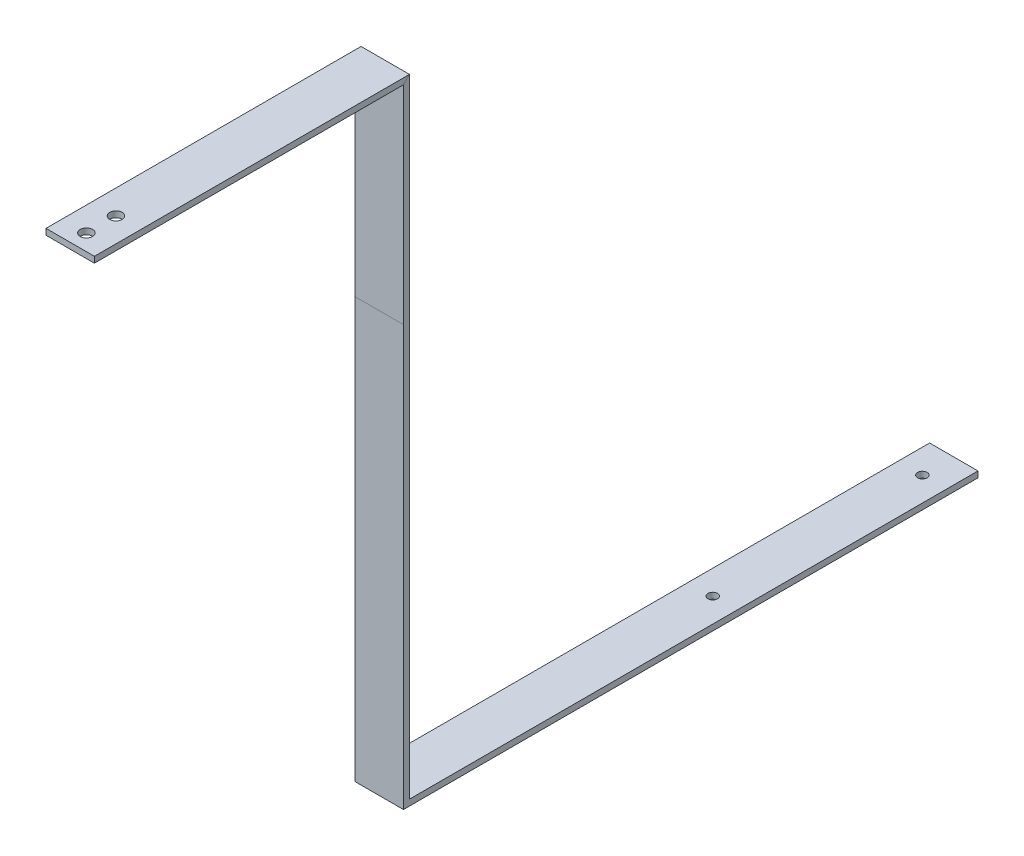
ISO-10303-21;
HEADER;
FILE_DESCRIPTION(('STEP AP214'),'2;1');
FILE_NAME('part.step','',(''),(''),'','','');
FILE_SCHEMA(('AUTOMOTIVE_DESIGN { 1 0 10303 214 1 1 1 1 }'));
ENDSEC;
DATA;
#1=APPLICATION_CONTEXT('core data for automotive mechanical design processes');
#2=APPLICATION_PROTOCOL_DEFINITION('international standard','automotive_design',2000,#1);
#3=PRODUCT_CONTEXT('',#1,'mechanical');
#4=PRODUCT('Part','Part','',(#3));
#5=PRODUCT_RELATED_PRODUCT_CATEGORY('part','',(#4));
#6=PRODUCT_DEFINITION_FORMATION('','',#4);
#7=PRODUCT_DEFINITION_CONTEXT('part definition',#1,'design');
#8=PRODUCT_DEFINITION('design','',#6,#7);
#9=PRODUCT_DEFINITION_SHAPE('','',#8);
#10=(LENGTH_UNIT() NAMED_UNIT(*) SI_UNIT(.MILLI.,.METRE.));
#11=(NAMED_UNIT(*) PLANE_ANGLE_UNIT() SI_UNIT($,.RADIAN.));
#12=(NAMED_UNIT(*) SI_UNIT($,.STERADIAN.) SOLID_ANGLE_UNIT());
#13=UNCERTAINTY_MEASURE_WITH_UNIT(LENGTH_MEASURE(1.E-05),#10,'distance_accuracy_value','');
#14=(GEOMETRIC_REPRESENTATION_CONTEXT(3) GLOBAL_UNCERTAINTY_ASSIGNED_CONTEXT((#13)) GLOBAL_UNIT_ASSIGNED_CONTEXT((#10,
#11,#12)) REPRESENTATION_CONTEXT('',''));
#15=CARTESIAN_POINT('',(0.,0.,0.));
#16=DIRECTION('',(0.,0.,1.));
#17=DIRECTION('',(1.,0.,0.));
#18=AXIS2_PLACEMENT_3D('',#15,#16,#17);
#19=CARTESIAN_POINT('',(-96.5999999999999,-272.07792076474,612.092449283312));
#20=DIRECTION('',(0.,-1.,0.));
#21=DIRECTION('',(0.,0.,-1.));
#22=AXIS2_PLACEMENT_3D('',#19,#20,#21);
#23=PLANE('',#22);
#24=DIRECTION('',(-1.,0.,0.));
#25=VECTOR('',#24,1.);
#26=CARTESIAN_POINT('',(-96.5999999999999,-272.07792076474,0.00397627219106411));
#27=LINE('',#26,#25);
#28=CARTESIAN_POINT('',(25.4,-272.07792076474,0.0039762721910086));
#29=VERTEX_POINT('',#28);
#30=CARTESIAN_POINT('',(-25.4,-272.07792076474,0.00397627219106411));
#31=VERTEX_POINT('',#30);
#32=EDGE_CURVE('E11',#29,#31,#27,.T.);
#33=ORIENTED_EDGE('',*,*,#32,.F.);
#34=DIRECTION('',(0.,0.,-1.));
#35=VECTOR('',#34,1.);
#36=CARTESIAN_POINT('',(25.4,-272.07792076474,612.092449283312));
#37=LINE('',#36,#35);
#38=CARTESIAN_POINT('',(25.4,-272.07792076474,0.));
#39=VERTEX_POINT('',#38);
#40=EDGE_CURVE('E166',#29,#39,#37,.T.);
#41=ORIENTED_EDGE('',*,*,#40,.T.);
#42=DIRECTION('',(1.,0.,0.));
#43=VECTOR('',#42,1.);
#44=CARTESIAN_POINT('',(0.,-272.07792076474,0.));
#45=LINE('',#44,#43);
#46=CARTESIAN_POINT('',(-25.4,-272.07792076474,0.));
#47=VERTEX_POINT('',#46);
#48=EDGE_CURVE('E283',#47,#39,#45,.T.);
#49=ORIENTED_EDGE('',*,*,#48,.F.);
#50=DIRECTION('',(0.,0.,-1.));
#51=VECTOR('',#50,1.);
#52=CARTESIAN_POINT('',(-25.4,-272.07792076474,574.));
#53=LINE('',#52,#51);
#54=EDGE_CURVE('E279',#31,#47,#53,.T.);
#55=ORIENTED_EDGE('',*,*,#54,.F.);
#56=EDGE_LOOP('',(#33,#41,#49,#55));
#57=FACE_BOUND('',#56,.T.);
#58=ADVANCED_FACE('F37',(#57),#23,.F.);
#59=CARTESIAN_POINT('',(25.4,3.155,574.));
#60=DIRECTION('',(-1.,0.,0.));
#61=DIRECTION('',(0.,0.,1.));
#62=AXIS2_PLACEMENT_3D('',#59,#60,#61);
#63=PLANE('',#62);
#64=DIRECTION('',(0.,1.,0.));
#65=VECTOR('',#64,1.);
#66=CARTESIAN_POINT('',(25.4,-278.803420764741,6.3139762721911));
#67=LINE('',#66,#65);
#68=CARTESIAN_POINT('',(25.4,-272.078734833776,6.31088055029496));
#69=VERTEX_POINT('',#68);
#70=CARTESIAN_POINT('',(25.4,-54.0479207647403,6.31397627219113));
#71=VERTEX_POINT('',#70);
#72=EDGE_CURVE('E180',#69,#71,#67,.T.);
#73=ORIENTED_EDGE('',*,*,#72,.F.);
#74=DIRECTION('',(0.,1.,0.));
#75=VECTOR('',#74,1.);
#76=CARTESIAN_POINT('',(25.4,-712.845,6.31000000000004));
#77=LINE('',#76,#75);
#78=CARTESIAN_POINT('',(25.4,-712.845,6.31000000000004));
#79=VERTEX_POINT('',#78);
#80=EDGE_CURVE('E41',#79,#69,#77,.T.);
#81=ORIENTED_EDGE('',*,*,#80,.F.);
#82=DIRECTION('',(0.,0.,-1.));
#83=VECTOR('',#82,1.);
#84=CARTESIAN_POINT('',(25.4,-712.845,0.));
#85=LINE('',#84,#83);
#86=CARTESIAN_POINT('',(25.4,-712.845,-596.7));
#87=VERTEX_POINT('',#86);
#88=EDGE_CURVE('E132',#79,#87,#85,.T.);
#89=ORIENTED_EDGE('',*,*,#88,.T.);
#90=DIRECTION('',(0.,1.,0.));
#91=VECTOR('',#90,1.);
#92=CARTESIAN_POINT('',(25.4,-706.535,-596.7));
#93=LINE('',#92,#91);
#94=CARTESIAN_POINT('',(25.4,-706.535,-596.7));
#95=VERTEX_POINT('',#94);
#96=EDGE_CURVE('E142',#87,#95,#93,.T.);
#97=ORIENTED_EDGE('',*,*,#96,.T.);
#98=DIRECTION('',(0.,0.,1.));
#99=VECTOR('',#98,1.);
#100=CARTESIAN_POINT('',(25.4,-706.535,-596.7));
#101=LINE('',#100,#99);
#102=CARTESIAN_POINT('',(25.4,-706.535,0.));
#103=VERTEX_POINT('',#102);
#104=EDGE_CURVE('E157',#95,#103,#101,.T.);
#105=ORIENTED_EDGE('',*,*,#104,.T.);
#106=DIRECTION('',(0.,1.,0.));
#107=VECTOR('',#106,1.);
#108=CARTESIAN_POINT('',(25.4,3.155,0.));
#109=LINE('',#108,#107);
#110=EDGE_CURVE('E55',#103,#39,#109,.T.);
#111=ORIENTED_EDGE('',*,*,#110,.T.);
#112=ORIENTED_EDGE('',*,*,#40,.F.);
#113=DIRECTION('',(0.,1.,0.));
#114=VECTOR('',#113,1.);
#115=CARTESIAN_POINT('',(25.4,-278.803420764741,0.0039762721910086));
#116=LINE('',#115,#114);
#117=CARTESIAN_POINT('',(25.4,-47.7379207647403,0.00397627219104076));
#118=VERTEX_POINT('',#117);
#119=EDGE_CURVE('E178',#29,#118,#116,.T.);
#120=ORIENTED_EDGE('',*,*,#119,.T.);
#121=DIRECTION('',(0.,0.707106781186548,-0.707106781186548));
#122=VECTOR('',#121,1.);
#123=CARTESIAN_POINT('',(25.4,-163.27067076474,115.536726272191));
#124=LINE('',#123,#122);
#125=EDGE_CURVE('E173',#71,#118,#124,.T.);
#126=ORIENTED_EDGE('',*,*,#125,.F.);
#127=EDGE_LOOP('',(#73,#81,#89,#97,#105,#111,#112,#120,#126));
#128=FACE_BOUND('',#127,.T.);
#129=ADVANCED_FACE('F39',(#128),#63,.F.);
#130=CARTESIAN_POINT('',(-25.4,3.155,574.));
#131=DIRECTION('',(1.,0.,0.));
#132=DIRECTION('',(0.,0.,-1.));
#133=AXIS2_PLACEMENT_3D('',#130,#131,#132);
#134=PLANE('',#133);
#135=DIRECTION('',(0.,-1.,0.));
#136=VECTOR('',#135,1.);
#137=CARTESIAN_POINT('',(-25.4,3.155,0.));
#138=LINE('',#137,#136);
#139=CARTESIAN_POINT('',(-25.4,-706.535,0.));
#140=VERTEX_POINT('',#139);
#141=EDGE_CURVE('E277',#47,#140,#138,.T.);
#142=ORIENTED_EDGE('',*,*,#141,.T.);
#143=DIRECTION('',(0.,0.,1.));
#144=VECTOR('',#143,1.);
#145=CARTESIAN_POINT('',(-25.4,-706.535,-596.7));
#146=LINE('',#145,#144);
#147=CARTESIAN_POINT('',(-25.4,-706.535,-596.7));
#148=VERTEX_POINT('',#147);
#149=EDGE_CURVE('E146',#148,#140,#146,.T.);
#150=ORIENTED_EDGE('',*,*,#149,.F.);
#151=DIRECTION('',(0.,-1.,0.));
#152=VECTOR('',#151,1.);
#153=CARTESIAN_POINT('',(-25.4,-706.535,-596.7));
#154=LINE('',#153,#152);
#155=CARTESIAN_POINT('',(-25.4,-712.845,-596.7));
#156=VERTEX_POINT('',#155);
#157=EDGE_CURVE('E139',#148,#156,#154,.T.);
#158=ORIENTED_EDGE('',*,*,#157,.T.);
#159=DIRECTION('',(0.,0.,1.));
#160=VECTOR('',#159,1.);
#161=CARTESIAN_POINT('',(-25.4,-712.845,0.));
#162=LINE('',#161,#160);
#163=CARTESIAN_POINT('',(-25.4,-712.845,6.31000000000004));
#164=VERTEX_POINT('',#163);
#165=EDGE_CURVE('E123',#156,#164,#162,.T.);
#166=ORIENTED_EDGE('',*,*,#165,.T.);
#167=DIRECTION('',(0.,1.,0.));
#168=VECTOR('',#167,1.);
#169=CARTESIAN_POINT('',(-25.4,-712.845,6.31000000000004));
#170=LINE('',#169,#168);
#171=CARTESIAN_POINT('',(-25.4,-272.078734833776,6.31088055029493));
#172=VERTEX_POINT('',#171);
#173=EDGE_CURVE('E265',#164,#172,#170,.T.);
#174=ORIENTED_EDGE('',*,*,#173,.T.);
#175=DIRECTION('',(0.,1.,0.));
#176=VECTOR('',#175,1.);
#177=CARTESIAN_POINT('',(-25.4,-278.803420764741,6.31397627219099));
#178=LINE('',#177,#176);
#179=CARTESIAN_POINT('',(-25.4,-54.0479207647402,6.31397627219104));
#180=VERTEX_POINT('',#179);
#181=EDGE_CURVE('E176',#172,#180,#178,.T.);
#182=ORIENTED_EDGE('',*,*,#181,.T.);
#183=DIRECTION('',(0.,-0.707106781186548,0.707106781186548));
#184=VECTOR('',#183,1.);
#185=CARTESIAN_POINT('',(-25.4,-163.27067076474,115.536726272191));
#186=LINE('',#185,#184);
#187=CARTESIAN_POINT('',(-25.4,-47.7379207647403,0.00397627219104109));
#188=VERTEX_POINT('',#187);
#189=EDGE_CURVE('E167',#188,#180,#186,.T.);
#190=ORIENTED_EDGE('',*,*,#189,.F.);
#191=DIRECTION('',(0.,1.,0.));
#192=VECTOR('',#191,1.);
#193=CARTESIAN_POINT('',(-25.4,-278.803420764741,0.0039762721910086));
#194=LINE('',#193,#192);
#195=EDGE_CURVE('E174',#31,#188,#194,.T.);
#196=ORIENTED_EDGE('',*,*,#195,.F.);
#197=ORIENTED_EDGE('',*,*,#54,.T.);
#198=EDGE_LOOP('',(#142,#150,#158,#166,#174,#182,#190,#196,#197));
#199=FACE_BOUND('',#198,.T.);
#200=ADVANCED_FACE('F144',(#199),#134,.F.);
#201=CARTESIAN_POINT('',(0.,0.,0.));
#202=DIRECTION('',(0.,0.,1.));
#203=DIRECTION('',(1.,0.,0.));
#204=AXIS2_PLACEMENT_3D('',#201,#202,#203);
#205=PLANE('',#204);
#206=ORIENTED_EDGE('',*,*,#110,.F.);
#207=DIRECTION('',(-1.,0.,0.));
#208=VECTOR('',#207,1.);
#209=CARTESIAN_POINT('',(0.,-706.535,0.));
#210=LINE('',#209,#208);
#211=EDGE_CURVE('E59',#103,#140,#210,.T.);
#212=ORIENTED_EDGE('',*,*,#211,.T.);
#213=ORIENTED_EDGE('',*,*,#141,.F.);
#214=ORIENTED_EDGE('',*,*,#48,.T.);
#215=EDGE_LOOP('',(#206,#212,#213,#214));
#216=FACE_BOUND('',#215,.T.);
#217=ADVANCED_FACE('F259',(#216),#205,.F.);
#218=CARTESIAN_POINT('',(-25.4,-712.845,6.31000000000004));
#219=DIRECTION('',(0.,0.,1.));
#220=DIRECTION('',(1.,0.,0.));
#221=AXIS2_PLACEMENT_3D('',#218,#219,#220);
#222=PLANE('',#221);
#223=CARTESIAN_POINT('',(-25.4,-272.07792076474,6.31397627219099));
#224=DIRECTION('',(1.,0.,0.));
#225=VECTOR('',#224,1.);
#226=LINE('',#223,#225);
#227=EDGE_CURVE('E47',#172,#69,#226,.T.);
#228=ORIENTED_EDGE('',*,*,#227,.F.);
#229=ORIENTED_EDGE('',*,*,#173,.F.);
#230=DIRECTION('',(1.,0.,0.));
#231=VECTOR('',#230,1.);
#232=CARTESIAN_POINT('',(-25.4,-712.845,6.31000000000004));
#233=LINE('',#232,#231);
#234=EDGE_CURVE('E129',#164,#79,#233,.T.);
#235=ORIENTED_EDGE('',*,*,#234,.T.);
#236=ORIENTED_EDGE('',*,*,#80,.T.);
#237=EDGE_LOOP('',(#228,#229,#235,#236));
#238=FACE_BOUND('',#237,.T.);
#239=ADVANCED_FACE('F254',(#238),#222,.T.);
#240=CARTESIAN_POINT('',(0.,-712.845,0.));
#241=DIRECTION('',(0.,1.,0.));
#242=DIRECTION('',(0.,0.,1.));
#243=AXIS2_PLACEMENT_3D('',#240,#241,#242);
#244=PLANE('',#243);
#245=CARTESIAN_POINT('',(0.,-712.845,-343.7));
#246=DIRECTION('',(0.,1.,0.));
#247=DIRECTION('',(0.,0.,1.));
#248=AXIS2_PLACEMENT_3D('',#245,#246,#247);
#249=CIRCLE('',#248,5.);
#250=CARTESIAN_POINT('',(0.,-712.845,-338.7));
#251=VERTEX_POINT('',#250);
#252=EDGE_CURVE('E441',#251,#251,#249,.T.);
#253=ORIENTED_EDGE('',*,*,#252,.T.);
#254=EDGE_LOOP('',(#253));
#255=FACE_BOUND('',#254,.T.);
#256=CARTESIAN_POINT('',(0.,-712.845,-563.7));
#257=DIRECTION('',(0.,1.,0.));
#258=DIRECTION('',(0.,0.,1.));
#259=AXIS2_PLACEMENT_3D('',#256,#257,#258);
#260=CIRCLE('',#259,5.);
#261=CARTESIAN_POINT('',(0.,-712.845,-558.7));
#262=VERTEX_POINT('',#261);
#263=EDGE_CURVE('E147',#262,#262,#260,.T.);
#264=ORIENTED_EDGE('',*,*,#263,.T.);
#265=EDGE_LOOP('',(#264));
#266=FACE_BOUND('',#265,.T.);
#267=ORIENTED_EDGE('',*,*,#88,.F.);
#268=ORIENTED_EDGE('',*,*,#234,.F.);
#269=ORIENTED_EDGE('',*,*,#165,.F.);
#270=DIRECTION('',(1.,0.,0.));
#271=VECTOR('',#270,1.);
#272=CARTESIAN_POINT('',(25.4,-712.845,-596.7));
#273=LINE('',#272,#271);
#274=EDGE_CURVE('E127',#156,#87,#273,.T.);
#275=ORIENTED_EDGE('',*,*,#274,.T.);
#276=EDGE_LOOP('',(#267,#268,#269,#275));
#277=FACE_BOUND('',#276,.T.);
#278=ADVANCED_FACE('F126',(#255,#266,#277),#244,.F.);
#279=CARTESIAN_POINT('',(-25.4,-278.803420764741,0.0039762721910086));
#280=DIRECTION('',(0.,0.,1.));
#281=DIRECTION('',(1.,0.,0.));
#282=AXIS2_PLACEMENT_3D('',#279,#280,#281);
#283=PLANE('',#282);
#284=ORIENTED_EDGE('',*,*,#119,.F.);
#285=ORIENTED_EDGE('',*,*,#32,.T.);
#286=ORIENTED_EDGE('',*,*,#195,.T.);
#287=DIRECTION('',(-1.,0.,0.));
#288=VECTOR('',#287,1.);
#289=CARTESIAN_POINT('',(-25.4,-47.7379207647402,0.0039762721910086));
#290=LINE('',#289,#288);
#291=EDGE_CURVE('E170',#118,#188,#290,.T.);
#292=ORIENTED_EDGE('',*,*,#291,.F.);
#293=EDGE_LOOP('',(#284,#285,#286,#292));
#294=FACE_BOUND('',#293,.T.);
#295=ADVANCED_FACE('F225',(#294),#283,.F.);
#296=CARTESIAN_POINT('',(0.,-326.125841529481,330.698976272191));
#297=DIRECTION('',(0.,0.,1.));
#298=DIRECTION('',(-1.,0.,0.));
#299=AXIS2_PLACEMENT_3D('',#296,#297,#298);
#300=PLANE('',#299);
#301=DIRECTION('',(0.,-1.,0.));
#302=VECTOR('',#301,1.);
#303=CARTESIAN_POINT('',(25.4,-47.7379207647403,330.698976272191));
#304=LINE('',#303,#302);
#305=CARTESIAN_POINT('',(25.4,-47.7379207647403,330.698976272191));
#306=VERTEX_POINT('',#305);
#307=CARTESIAN_POINT('',(25.4,-54.0479207647404,330.698976272191));
#308=VERTEX_POINT('',#307);
#309=EDGE_CURVE('E188',#306,#308,#304,.T.);
#310=ORIENTED_EDGE('',*,*,#309,.F.);
#311=DIRECTION('',(1.,0.,0.));
#312=VECTOR('',#311,1.);
#313=CARTESIAN_POINT('',(-25.4,-47.7379207647403,330.698976272191));
#314=LINE('',#313,#312);
#315=CARTESIAN_POINT('',(-25.4,-47.7379207647403,330.698976272191));
#316=VERTEX_POINT('',#315);
#317=EDGE_CURVE('E162',#316,#306,#314,.T.);
#318=ORIENTED_EDGE('',*,*,#317,.F.);
#319=DIRECTION('',(0.,1.,0.));
#320=VECTOR('',#319,1.);
#321=CARTESIAN_POINT('',(-25.4,-47.7379207647403,330.698976272191));
#322=LINE('',#321,#320);
#323=CARTESIAN_POINT('',(-25.4,-54.0479207647402,330.698976272191));
#324=VERTEX_POINT('',#323);
#325=EDGE_CURVE('E184',#324,#316,#322,.T.);
#326=ORIENTED_EDGE('',*,*,#325,.F.);
#327=DIRECTION('',(-1.,0.,0.));
#328=VECTOR('',#327,1.);
#329=CARTESIAN_POINT('',(-25.4,-54.0479207647402,330.698976272191));
#330=LINE('',#329,#328);
#331=EDGE_CURVE('E186',#308,#324,#330,.T.);
#332=ORIENTED_EDGE('',*,*,#331,.F.);
#333=EDGE_LOOP('',(#310,#318,#326,#332));
#334=FACE_BOUND('',#333,.T.);
#335=ADVANCED_FACE('F229',(#334),#300,.T.);
#336=CARTESIAN_POINT('',(25.4,-47.7379207647403,-0.411523727808952));
#337=DIRECTION('',(-1.,0.,0.));
#338=DIRECTION('',(0.,-1.,0.));
#339=AXIS2_PLACEMENT_3D('',#336,#337,#338);
#340=PLANE('',#339);
#341=ORIENTED_EDGE('',*,*,#125,.T.);
#342=DIRECTION('',(0.,0.,1.));
#343=VECTOR('',#342,1.);
#344=CARTESIAN_POINT('',(25.4,-47.7379207647403,-0.411523727808952));
#345=LINE('',#344,#343);
#346=EDGE_CURVE('E177',#118,#306,#345,.T.);
#347=ORIENTED_EDGE('',*,*,#346,.T.);
#348=ORIENTED_EDGE('',*,*,#309,.T.);
#349=DIRECTION('',(0.,0.,1.));
#350=VECTOR('',#349,1.);
#351=CARTESIAN_POINT('',(25.4,-54.0479207647404,-0.411523727808951));
#352=LINE('',#351,#350);
#353=EDGE_CURVE('E196',#71,#308,#352,.T.);
#354=ORIENTED_EDGE('',*,*,#353,.F.);
#355=EDGE_LOOP('',(#341,#347,#348,#354));
#356=FACE_BOUND('',#355,.T.);
#357=ADVANCED_FACE('F231',(#356),#340,.F.);
#358=CARTESIAN_POINT('',(-25.4,-54.0479207647402,-0.411523727808951));
#359=DIRECTION('',(0.,1.,0.));
#360=DIRECTION('',(-1.,0.,0.));
#361=AXIS2_PLACEMENT_3D('',#358,#359,#360);
#362=PLANE('',#361);
#363=CARTESIAN_POINT('',(0.,-54.0479207647403,282.69897627246));
#364=DIRECTION('',(0.,1.,0.));
#365=DIRECTION('',(-1.,0.,0.));
#366=AXIS2_PLACEMENT_3D('',#363,#364,#365);
#367=CIRCLE('',#366,6.5);
#368=CARTESIAN_POINT('',(-6.5,-54.0479207647403,282.69897627246));
#369=VERTEX_POINT('',#368);
#370=EDGE_CURVE('E428',#369,#369,#367,.T.);
#371=ORIENTED_EDGE('',*,*,#370,.T.);
#372=EDGE_LOOP('',(#371));
#373=FACE_BOUND('',#372,.T.);
#374=CARTESIAN_POINT('',(0.,-54.0479207647403,313.69897627246));
#375=DIRECTION('',(0.,1.,0.));
#376=DIRECTION('',(-1.,0.,0.));
#377=AXIS2_PLACEMENT_3D('',#374,#375,#376);
#378=CIRCLE('',#377,6.5);
#379=CARTESIAN_POINT('',(-6.5,-54.0479207647403,313.69897627246));
#380=VERTEX_POINT('',#379);
#381=EDGE_CURVE('E432',#380,#380,#378,.T.);
#382=ORIENTED_EDGE('',*,*,#381,.T.);
#383=EDGE_LOOP('',(#382));
#384=FACE_BOUND('',#383,.T.);
#385=DIRECTION('',(1.,0.,0.));
#386=VECTOR('',#385,1.);
#387=CARTESIAN_POINT('',(-25.3999999999995,-54.0479207647402,6.31397627219099));
#388=LINE('',#387,#386);
#389=EDGE_CURVE('E163',#180,#71,#388,.T.);
#390=ORIENTED_EDGE('',*,*,#389,.T.);
#391=ORIENTED_EDGE('',*,*,#353,.T.);
#392=ORIENTED_EDGE('',*,*,#331,.T.);
#393=DIRECTION('',(0.,0.,1.));
#394=VECTOR('',#393,1.);
#395=CARTESIAN_POINT('',(-25.4,-54.0479207647402,-0.411523727808951));
#396=LINE('',#395,#394);
#397=EDGE_CURVE('E193',#180,#324,#396,.T.);
#398=ORIENTED_EDGE('',*,*,#397,.F.);
#399=EDGE_LOOP('',(#390,#391,#392,#398));
#400=FACE_BOUND('',#399,.T.);
#401=ADVANCED_FACE('F234',(#373,#384,#400),#362,.F.);
#402=CARTESIAN_POINT('',(-25.4,-47.7379207647403,-0.411523727808952));
#403=DIRECTION('',(1.,0.,0.));
#404=DIRECTION('',(0.,1.,0.));
#405=AXIS2_PLACEMENT_3D('',#402,#403,#404);
#406=PLANE('',#405);
#407=ORIENTED_EDGE('',*,*,#189,.T.);
#408=ORIENTED_EDGE('',*,*,#397,.T.);
#409=ORIENTED_EDGE('',*,*,#325,.T.);
#410=DIRECTION('',(0.,0.,1.));
#411=VECTOR('',#410,1.);
#412=CARTESIAN_POINT('',(-25.4,-47.7379207647403,-0.411523727808952));
#413=LINE('',#412,#411);
#414=EDGE_CURVE('E190',#188,#316,#413,.T.);
#415=ORIENTED_EDGE('',*,*,#414,.F.);
#416=EDGE_LOOP('',(#407,#408,#409,#415));
#417=FACE_BOUND('',#416,.T.);
#418=ADVANCED_FACE('F238',(#417),#406,.F.);
#419=CARTESIAN_POINT('',(-25.4,-47.7379207647403,-0.411523727808952));
#420=DIRECTION('',(0.,-1.,0.));
#421=DIRECTION('',(1.,0.,0.));
#422=AXIS2_PLACEMENT_3D('',#419,#420,#421);
#423=PLANE('',#422);
#424=CARTESIAN_POINT('',(0.,-47.7379207647403,282.69897627246));
#425=DIRECTION('',(0.,1.,0.));
#426=DIRECTION('',(-1.,0.,0.));
#427=AXIS2_PLACEMENT_3D('',#424,#425,#426);
#428=CIRCLE('',#427,6.5);
#429=CARTESIAN_POINT('',(-6.5,-47.7379207647403,282.69897627246));
#430=VERTEX_POINT('',#429);
#431=EDGE_CURVE('E425',#430,#430,#428,.T.);
#432=ORIENTED_EDGE('',*,*,#431,.F.);
#433=EDGE_LOOP('',(#432));
#434=FACE_BOUND('',#433,.T.);
#435=CARTESIAN_POINT('',(0.,-47.7379207647403,313.69897627246));
#436=DIRECTION('',(0.,1.,0.));
#437=DIRECTION('',(-1.,0.,0.));
#438=AXIS2_PLACEMENT_3D('',#435,#436,#437);
#439=CIRCLE('',#438,6.5);
#440=CARTESIAN_POINT('',(-6.5,-47.7379207647403,313.69897627246));
#441=VERTEX_POINT('',#440);
#442=EDGE_CURVE('E429',#441,#441,#439,.T.);
#443=ORIENTED_EDGE('',*,*,#442,.F.);
#444=EDGE_LOOP('',(#443));
#445=FACE_BOUND('',#444,.T.);
#446=ORIENTED_EDGE('',*,*,#291,.T.);
#447=ORIENTED_EDGE('',*,*,#414,.T.);
#448=ORIENTED_EDGE('',*,*,#317,.T.);
#449=ORIENTED_EDGE('',*,*,#346,.F.);
#450=EDGE_LOOP('',(#446,#447,#448,#449));
#451=FACE_BOUND('',#450,.T.);
#452=ADVANCED_FACE('F224',(#434,#445,#451),#423,.F.);
#453=CARTESIAN_POINT('',(-25.4,-278.803420764741,6.31397627219099));
#454=DIRECTION('',(0.,0.,-1.));
#455=DIRECTION('',(-1.,0.,0.));
#456=AXIS2_PLACEMENT_3D('',#453,#454,#455);
#457=PLANE('',#456);
#458=ORIENTED_EDGE('',*,*,#181,.F.);
#459=ORIENTED_EDGE('',*,*,#227,.T.);
#460=ORIENTED_EDGE('',*,*,#72,.T.);
#461=ORIENTED_EDGE('',*,*,#389,.F.);
#462=EDGE_LOOP('',(#458,#459,#460,#461));
#463=FACE_BOUND('',#462,.T.);
#464=ADVANCED_FACE('F213',(#463),#457,.F.);
#465=CARTESIAN_POINT('',(25.4,-706.535,-596.7));
#466=DIRECTION('',(0.,1.,0.));
#467=DIRECTION('',(0.,0.,1.));
#468=AXIS2_PLACEMENT_3D('',#465,#466,#467);
#469=PLANE('',#468);
#470=CARTESIAN_POINT('',(0.,-706.535,-343.7));
#471=DIRECTION('',(0.,1.,0.));
#472=DIRECTION('',(0.,0.,1.));
#473=AXIS2_PLACEMENT_3D('',#470,#471,#472);
#474=CIRCLE('',#473,5.);
#475=CARTESIAN_POINT('',(0.,-706.535,-338.7));
#476=VERTEX_POINT('',#475);
#477=EDGE_CURVE('E438',#476,#476,#474,.T.);
#478=ORIENTED_EDGE('',*,*,#477,.F.);
#479=EDGE_LOOP('',(#478));
#480=FACE_BOUND('',#479,.T.);
#481=CARTESIAN_POINT('',(0.,-706.535,-563.7));
#482=DIRECTION('',(0.,1.,0.));
#483=DIRECTION('',(0.,0.,1.));
#484=AXIS2_PLACEMENT_3D('',#481,#482,#483);
#485=CIRCLE('',#484,5.);
#486=CARTESIAN_POINT('',(0.,-706.535,-558.7));
#487=VERTEX_POINT('',#486);
#488=EDGE_CURVE('E150',#487,#487,#485,.T.);
#489=ORIENTED_EDGE('',*,*,#488,.F.);
#490=EDGE_LOOP('',(#489));
#491=FACE_BOUND('',#490,.T.);
#492=ORIENTED_EDGE('',*,*,#211,.F.);
#493=ORIENTED_EDGE('',*,*,#104,.F.);
#494=DIRECTION('',(-1.,0.,0.));
#495=VECTOR('',#494,1.);
#496=CARTESIAN_POINT('',(25.4,-706.535,-596.7));
#497=LINE('',#496,#495);
#498=EDGE_CURVE('E155',#95,#148,#497,.T.);
#499=ORIENTED_EDGE('',*,*,#498,.T.);
#500=ORIENTED_EDGE('',*,*,#149,.T.);
#501=EDGE_LOOP('',(#492,#493,#499,#500));
#502=FACE_BOUND('',#501,.T.);
#503=ADVANCED_FACE('F223',(#480,#491,#502),#469,.T.);
#504=CARTESIAN_POINT('',(0.,0.,-596.7));
#505=DIRECTION('',(0.,0.,-1.));
#506=DIRECTION('',(-1.,0.,0.));
#507=AXIS2_PLACEMENT_3D('',#504,#505,#506);
#508=PLANE('',#507);
#509=ORIENTED_EDGE('',*,*,#157,.F.);
#510=ORIENTED_EDGE('',*,*,#498,.F.);
#511=ORIENTED_EDGE('',*,*,#96,.F.);
#512=ORIENTED_EDGE('',*,*,#274,.F.);
#513=EDGE_LOOP('',(#509,#510,#511,#512));
#514=FACE_BOUND('',#513,.T.);
#515=ADVANCED_FACE('F137',(#514),#508,.T.);
#516=CARTESIAN_POINT('',(0.,-716.535,-563.7));
#517=DIRECTION('',(0.,1.,0.));
#518=DIRECTION('',(0.,0.,1.));
#519=AXIS2_PLACEMENT_3D('',#516,#517,#518);
#520=CYLINDRICAL_SURFACE('',#519,5.);
#521=ORIENTED_EDGE('',*,*,#488,.T.);
#522=EDGE_LOOP('',(#521));
#523=FACE_BOUND('',#522,.T.);
#524=ORIENTED_EDGE('',*,*,#263,.F.);
#525=EDGE_LOOP('',(#524));
#526=FACE_BOUND('',#525,.T.);
#527=ADVANCED_FACE('F372',(#523,#526),#520,.F.);
#528=CARTESIAN_POINT('',(0.,-716.535,-343.7));
#529=DIRECTION('',(0.,1.,0.));
#530=DIRECTION('',(0.,0.,1.));
#531=AXIS2_PLACEMENT_3D('',#528,#529,#530);
#532=CYLINDRICAL_SURFACE('',#531,5.);
#533=ORIENTED_EDGE('',*,*,#477,.T.);
#534=EDGE_LOOP('',(#533));
#535=FACE_BOUND('',#534,.T.);
#536=ORIENTED_EDGE('',*,*,#252,.F.);
#537=EDGE_LOOP('',(#536));
#538=FACE_BOUND('',#537,.T.);
#539=ADVANCED_FACE('F377',(#535,#538),#532,.F.);
#540=CARTESIAN_POINT('',(0.,-57.7379207647403,313.69897627246));
#541=DIRECTION('',(0.,1.,0.));
#542=DIRECTION('',(-1.,0.,0.));
#543=AXIS2_PLACEMENT_3D('',#540,#541,#542);
#544=CYLINDRICAL_SURFACE('',#543,6.5);
#545=ORIENTED_EDGE('',*,*,#442,.T.);
#546=EDGE_LOOP('',(#545));
#547=FACE_BOUND('',#546,.T.);
#548=ORIENTED_EDGE('',*,*,#381,.F.);
#549=EDGE_LOOP('',(#548));
#550=FACE_BOUND('',#549,.T.);
#551=ADVANCED_FACE('F387',(#547,#550),#544,.F.);
#552=CARTESIAN_POINT('',(0.,-57.7379207647403,282.69897627246));
#553=DIRECTION('',(0.,1.,0.));
#554=DIRECTION('',(-1.,0.,0.));
#555=AXIS2_PLACEMENT_3D('',#552,#553,#554);
#556=CYLINDRICAL_SURFACE('',#555,6.5);
#557=ORIENTED_EDGE('',*,*,#431,.T.);
#558=EDGE_LOOP('',(#557));
#559=FACE_BOUND('',#558,.T.);
#560=ORIENTED_EDGE('',*,*,#370,.F.);
#561=EDGE_LOOP('',(#560));
#562=FACE_BOUND('',#561,.T.);
#563=ADVANCED_FACE('F407',(#559,#562),#556,.F.);
#564=CLOSED_SHELL('',(#58,#129,#200,#217,#239,#278,#295,#335,#357,#401,#418,#452,#464,#503,#515,
#527,#539,#551,#563));
#565=MANIFOLD_SOLID_BREP('B2',#564);
#566=ADVANCED_BREP_SHAPE_REPRESENTATION('',(#18,#565),#14);
#567=SHAPE_DEFINITION_REPRESENTATION(#9,#566);
ENDSEC;
END-ISO-10303-21;
